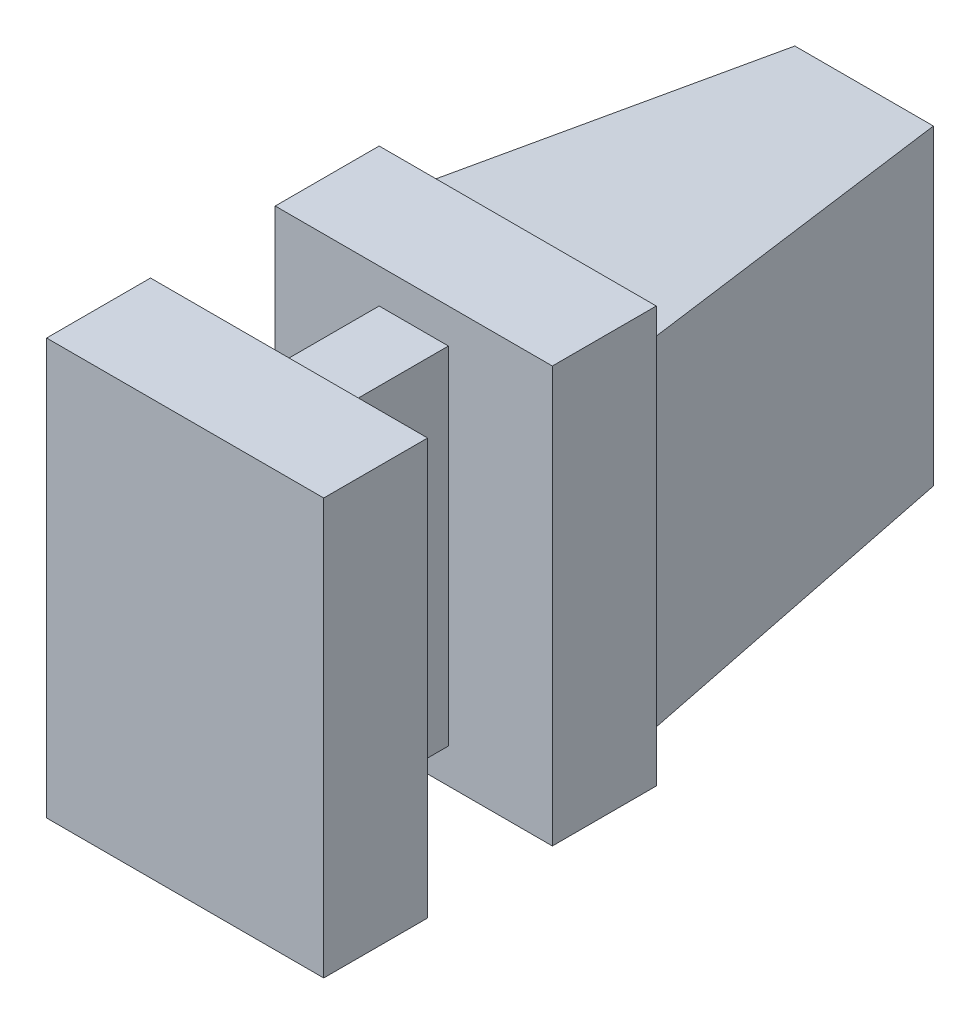
ISO-10303-21;
HEADER;
FILE_DESCRIPTION(('STEP AP214'),'2;1');
FILE_NAME('part.step','',(''),(''),'','','');
FILE_SCHEMA(('AUTOMOTIVE_DESIGN { 1 0 10303 214 1 1 1 1 }'));
ENDSEC;
DATA;
#1=APPLICATION_CONTEXT('core data for automotive mechanical design processes');
#2=APPLICATION_PROTOCOL_DEFINITION('international standard','automotive_design',2000,#1);
#3=PRODUCT_CONTEXT('',#1,'mechanical');
#4=PRODUCT('Part','Part','',(#3));
#5=PRODUCT_RELATED_PRODUCT_CATEGORY('part','',(#4));
#6=PRODUCT_DEFINITION_FORMATION('','',#4);
#7=PRODUCT_DEFINITION_CONTEXT('part definition',#1,'design');
#8=PRODUCT_DEFINITION('design','',#6,#7);
#9=PRODUCT_DEFINITION_SHAPE('','',#8);
#10=(LENGTH_UNIT() NAMED_UNIT(*) SI_UNIT(.MILLI.,.METRE.));
#11=(NAMED_UNIT(*) PLANE_ANGLE_UNIT() SI_UNIT($,.RADIAN.));
#12=(NAMED_UNIT(*) SI_UNIT($,.STERADIAN.) SOLID_ANGLE_UNIT());
#13=UNCERTAINTY_MEASURE_WITH_UNIT(LENGTH_MEASURE(1.E-05),#10,'distance_accuracy_value','');
#14=(GEOMETRIC_REPRESENTATION_CONTEXT(3) GLOBAL_UNCERTAINTY_ASSIGNED_CONTEXT((#13)) GLOBAL_UNIT_ASSIGNED_CONTEXT((#10,
#11,#12)) REPRESENTATION_CONTEXT('',''));
#15=CARTESIAN_POINT('',(0.,0.,0.));
#16=DIRECTION('',(0.,0.,1.));
#17=DIRECTION('',(1.,0.,0.));
#18=AXIS2_PLACEMENT_3D('',#15,#16,#17);
#19=CARTESIAN_POINT('',(0.500000000000001,2.5,1.8));
#20=DIRECTION('',(-1.,0.,0.));
#21=DIRECTION('',(0.,-1.,0.));
#22=AXIS2_PLACEMENT_3D('',#19,#20,#21);
#23=PLANE('',#22);
#24=DIRECTION('',(0.,1.,0.));
#25=VECTOR('',#24,1.);
#26=CARTESIAN_POINT('',(0.500000000000001,2.5,0.));
#27=LINE('',#26,#25);
#28=CARTESIAN_POINT('',(0.500000000000002,-2.5,0.));
#29=VERTEX_POINT('',#28);
#30=CARTESIAN_POINT('',(0.500000000000002,2.5,0.));
#31=VERTEX_POINT('',#30);
#32=EDGE_CURVE('E78',#29,#31,#27,.T.);
#33=ORIENTED_EDGE('',*,*,#32,.T.);
#34=DIRECTION('',(0.,0.,-1.));
#35=VECTOR('',#34,1.);
#36=CARTESIAN_POINT('',(0.500000000000001,2.5,1.8));
#37=LINE('',#36,#35);
#38=CARTESIAN_POINT('',(0.500000000000001,2.5,1.8));
#39=VERTEX_POINT('',#38);
#40=EDGE_CURVE('E12',#39,#31,#37,.T.);
#41=ORIENTED_EDGE('',*,*,#40,.F.);
#42=DIRECTION('',(0.,1.,0.));
#43=VECTOR('',#42,1.);
#44=CARTESIAN_POINT('',(0.500000000000001,2.5,1.8));
#45=LINE('',#44,#43);
#46=CARTESIAN_POINT('',(0.500000000000002,-2.5,1.8));
#47=VERTEX_POINT('',#46);
#48=EDGE_CURVE('E337',#47,#39,#45,.T.);
#49=ORIENTED_EDGE('',*,*,#48,.F.);
#50=DIRECTION('',(0.,0.,-1.));
#51=VECTOR('',#50,1.);
#52=CARTESIAN_POINT('',(0.500000000000002,-2.5,1.8));
#53=LINE('',#52,#51);
#54=EDGE_CURVE('E322',#47,#29,#53,.T.);
#55=ORIENTED_EDGE('',*,*,#54,.T.);
#56=EDGE_LOOP('',(#33,#41,#49,#55));
#57=FACE_BOUND('',#56,.T.);
#58=ADVANCED_FACE('F40',(#57),#23,.F.);
#59=CARTESIAN_POINT('',(-0.499999999999999,2.5,1.8));
#60=DIRECTION('',(0.,-1.,0.));
#61=DIRECTION('',(0.,0.,-1.));
#62=AXIS2_PLACEMENT_3D('',#59,#60,#61);
#63=PLANE('',#62);
#64=DIRECTION('',(-1.,0.,0.));
#65=VECTOR('',#64,1.);
#66=CARTESIAN_POINT('',(-0.499999999999999,2.5,0.));
#67=LINE('',#66,#65);
#68=CARTESIAN_POINT('',(-0.499999999999999,2.5,0.));
#69=VERTEX_POINT('',#68);
#70=EDGE_CURVE('E85',#31,#69,#67,.T.);
#71=ORIENTED_EDGE('',*,*,#70,.T.);
#72=DIRECTION('',(0.,0.,-1.));
#73=VECTOR('',#72,1.);
#74=CARTESIAN_POINT('',(-0.499999999999999,2.5,1.8));
#75=LINE('',#74,#73);
#76=CARTESIAN_POINT('',(-0.499999999999999,2.5,1.8));
#77=VERTEX_POINT('',#76);
#78=EDGE_CURVE('E48',#77,#69,#75,.T.);
#79=ORIENTED_EDGE('',*,*,#78,.F.);
#80=DIRECTION('',(-1.,0.,0.));
#81=VECTOR('',#80,1.);
#82=CARTESIAN_POINT('',(-0.499999999999999,2.5,1.8));
#83=LINE('',#82,#81);
#84=EDGE_CURVE('E401',#39,#77,#83,.T.);
#85=ORIENTED_EDGE('',*,*,#84,.F.);
#86=ORIENTED_EDGE('',*,*,#40,.T.);
#87=EDGE_LOOP('',(#71,#79,#85,#86));
#88=FACE_BOUND('',#87,.T.);
#89=ADVANCED_FACE('F311',(#88),#63,.F.);
#90=CARTESIAN_POINT('',(-0.499999999999999,2.5,1.8));
#91=DIRECTION('',(1.,0.,0.));
#92=DIRECTION('',(0.,1.,0.));
#93=AXIS2_PLACEMENT_3D('',#90,#91,#92);
#94=PLANE('',#93);
#95=DIRECTION('',(0.,-1.,0.));
#96=VECTOR('',#95,1.);
#97=CARTESIAN_POINT('',(-0.499999999999999,2.5,0.));
#98=LINE('',#97,#96);
#99=CARTESIAN_POINT('',(-0.499999999999998,-2.5,0.));
#100=VERTEX_POINT('',#99);
#101=EDGE_CURVE('E325',#69,#100,#98,.T.);
#102=ORIENTED_EDGE('',*,*,#101,.T.);
#103=DIRECTION('',(0.,0.,-1.));
#104=VECTOR('',#103,1.);
#105=CARTESIAN_POINT('',(-0.499999999999998,-2.5,1.8));
#106=LINE('',#105,#104);
#107=CARTESIAN_POINT('',(-0.499999999999998,-2.5,1.8));
#108=VERTEX_POINT('',#107);
#109=EDGE_CURVE('E65',#108,#100,#106,.T.);
#110=ORIENTED_EDGE('',*,*,#109,.F.);
#111=DIRECTION('',(0.,-1.,0.));
#112=VECTOR('',#111,1.);
#113=CARTESIAN_POINT('',(-0.499999999999999,2.5,1.8));
#114=LINE('',#113,#112);
#115=EDGE_CURVE('E403',#77,#108,#114,.T.);
#116=ORIENTED_EDGE('',*,*,#115,.F.);
#117=ORIENTED_EDGE('',*,*,#78,.T.);
#118=EDGE_LOOP('',(#102,#110,#116,#117));
#119=FACE_BOUND('',#118,.T.);
#120=ADVANCED_FACE('F316',(#119),#94,.F.);
#121=CARTESIAN_POINT('',(-0.499999999999998,-2.5,1.8));
#122=DIRECTION('',(0.,1.,0.));
#123=DIRECTION('',(0.,0.,1.));
#124=AXIS2_PLACEMENT_3D('',#121,#122,#123);
#125=PLANE('',#124);
#126=DIRECTION('',(1.,0.,0.));
#127=VECTOR('',#126,1.);
#128=CARTESIAN_POINT('',(-0.499999999999998,-2.5,0.));
#129=LINE('',#128,#127);
#130=EDGE_CURVE('E335',#100,#29,#129,.T.);
#131=ORIENTED_EDGE('',*,*,#130,.T.);
#132=ORIENTED_EDGE('',*,*,#54,.F.);
#133=DIRECTION('',(1.,0.,0.));
#134=VECTOR('',#133,1.);
#135=CARTESIAN_POINT('',(-0.499999999999998,-2.5,1.8));
#136=LINE('',#135,#134);
#137=EDGE_CURVE('E331',#108,#47,#136,.T.);
#138=ORIENTED_EDGE('',*,*,#137,.F.);
#139=ORIENTED_EDGE('',*,*,#109,.T.);
#140=EDGE_LOOP('',(#131,#132,#138,#139));
#141=FACE_BOUND('',#140,.T.);
#142=ADVANCED_FACE('F408',(#141),#125,.F.);
#143=CARTESIAN_POINT('',(-2.,3.,0.));
#144=DIRECTION('',(0.,0.,1.));
#145=DIRECTION('',(1.,0.,0.));
#146=AXIS2_PLACEMENT_3D('',#143,#144,#145);
#147=PLANE('',#146);
#148=DIRECTION('',(0.,1.,0.));
#149=VECTOR('',#148,1.);
#150=CARTESIAN_POINT('',(-2.,-3.,0.));
#151=LINE('',#150,#149);
#152=CARTESIAN_POINT('',(-2.,-3.,0.));
#153=VERTEX_POINT('',#152);
#154=CARTESIAN_POINT('',(-2.,3.,0.));
#155=VERTEX_POINT('',#154);
#156=EDGE_CURVE('E376',#153,#155,#151,.T.);
#157=ORIENTED_EDGE('',*,*,#156,.F.);
#158=DIRECTION('',(-1.,0.,0.));
#159=VECTOR('',#158,1.);
#160=CARTESIAN_POINT('',(2.,-3.,0.));
#161=LINE('',#160,#159);
#162=CARTESIAN_POINT('',(2.,-3.,0.));
#163=VERTEX_POINT('',#162);
#164=EDGE_CURVE('E371',#163,#153,#161,.T.);
#165=ORIENTED_EDGE('',*,*,#164,.F.);
#166=DIRECTION('',(0.,-1.,0.));
#167=VECTOR('',#166,1.);
#168=CARTESIAN_POINT('',(2.,-3.,0.));
#169=LINE('',#168,#167);
#170=CARTESIAN_POINT('',(2.,3.,0.));
#171=VERTEX_POINT('',#170);
#172=EDGE_CURVE('E392',#171,#163,#169,.T.);
#173=ORIENTED_EDGE('',*,*,#172,.F.);
#174=DIRECTION('',(1.,0.,0.));
#175=VECTOR('',#174,1.);
#176=CARTESIAN_POINT('',(2.,3.,0.));
#177=LINE('',#176,#175);
#178=EDGE_CURVE('E379',#155,#171,#177,.T.);
#179=ORIENTED_EDGE('',*,*,#178,.F.);
#180=EDGE_LOOP('',(#157,#165,#173,#179));
#181=FACE_BOUND('',#180,.T.);
#182=ORIENTED_EDGE('',*,*,#32,.F.);
#183=ORIENTED_EDGE('',*,*,#130,.F.);
#184=ORIENTED_EDGE('',*,*,#101,.F.);
#185=ORIENTED_EDGE('',*,*,#70,.F.);
#186=EDGE_LOOP('',(#182,#183,#184,#185));
#187=FACE_BOUND('',#186,.T.);
#188=ADVANCED_FACE('F409',(#181,#187),#147,.T.);
#189=CARTESIAN_POINT('',(-2.,-3.,-1.5));
#190=DIRECTION('',(1.,0.,0.));
#191=DIRECTION('',(0.,0.,-1.));
#192=AXIS2_PLACEMENT_3D('',#189,#190,#191);
#193=PLANE('',#192);
#194=ORIENTED_EDGE('',*,*,#156,.T.);
#195=DIRECTION('',(0.,0.,1.));
#196=VECTOR('',#195,1.);
#197=CARTESIAN_POINT('',(-2.,3.,-1.5));
#198=LINE('',#197,#196);
#199=CARTESIAN_POINT('',(-2.,3.,-1.5));
#200=VERTEX_POINT('',#199);
#201=EDGE_CURVE('E323',#200,#155,#198,.T.);
#202=ORIENTED_EDGE('',*,*,#201,.F.);
#203=DIRECTION('',(0.,1.,0.));
#204=VECTOR('',#203,1.);
#205=CARTESIAN_POINT('',(-2.,-3.,-1.5));
#206=LINE('',#205,#204);
#207=CARTESIAN_POINT('',(-2.,-3.,-1.5));
#208=VERTEX_POINT('',#207);
#209=EDGE_CURVE('E362',#208,#200,#206,.T.);
#210=ORIENTED_EDGE('',*,*,#209,.F.);
#211=DIRECTION('',(0.,0.,1.));
#212=VECTOR('',#211,1.);
#213=CARTESIAN_POINT('',(-2.,-3.,-1.5));
#214=LINE('',#213,#212);
#215=EDGE_CURVE('E388',#208,#153,#214,.T.);
#216=ORIENTED_EDGE('',*,*,#215,.T.);
#217=EDGE_LOOP('',(#194,#202,#210,#216));
#218=FACE_BOUND('',#217,.T.);
#219=ADVANCED_FACE('F374',(#218),#193,.F.);
#220=CARTESIAN_POINT('',(2.,3.,-1.5));
#221=DIRECTION('',(0.,-1.,0.));
#222=DIRECTION('',(0.,0.,-1.));
#223=AXIS2_PLACEMENT_3D('',#220,#221,#222);
#224=PLANE('',#223);
#225=ORIENTED_EDGE('',*,*,#178,.T.);
#226=DIRECTION('',(0.,0.,1.));
#227=VECTOR('',#226,1.);
#228=CARTESIAN_POINT('',(2.,3.,-1.5));
#229=LINE('',#228,#227);
#230=CARTESIAN_POINT('',(2.,3.,-1.5));
#231=VERTEX_POINT('',#230);
#232=EDGE_CURVE('E328',#231,#171,#229,.T.);
#233=ORIENTED_EDGE('',*,*,#232,.F.);
#234=DIRECTION('',(1.,0.,0.));
#235=VECTOR('',#234,1.);
#236=CARTESIAN_POINT('',(2.,3.,-1.5));
#237=LINE('',#236,#235);
#238=EDGE_CURVE('E364',#200,#231,#237,.T.);
#239=ORIENTED_EDGE('',*,*,#238,.F.);
#240=ORIENTED_EDGE('',*,*,#201,.T.);
#241=EDGE_LOOP('',(#225,#233,#239,#240));
#242=FACE_BOUND('',#241,.T.);
#243=ADVANCED_FACE('F378',(#242),#224,.F.);
#244=CARTESIAN_POINT('',(2.,-3.,-1.5));
#245=DIRECTION('',(-1.,0.,0.));
#246=DIRECTION('',(0.,0.,1.));
#247=AXIS2_PLACEMENT_3D('',#244,#245,#246);
#248=PLANE('',#247);
#249=ORIENTED_EDGE('',*,*,#172,.T.);
#250=DIRECTION('',(0.,0.,1.));
#251=VECTOR('',#250,1.);
#252=CARTESIAN_POINT('',(2.,-3.,-1.5));
#253=LINE('',#252,#251);
#254=CARTESIAN_POINT('',(2.,-3.,-1.5));
#255=VERTEX_POINT('',#254);
#256=EDGE_CURVE('E396',#255,#163,#253,.T.);
#257=ORIENTED_EDGE('',*,*,#256,.F.);
#258=DIRECTION('',(0.,-1.,0.));
#259=VECTOR('',#258,1.);
#260=CARTESIAN_POINT('',(2.,-3.,-1.5));
#261=LINE('',#260,#259);
#262=EDGE_CURVE('E382',#231,#255,#261,.T.);
#263=ORIENTED_EDGE('',*,*,#262,.F.);
#264=ORIENTED_EDGE('',*,*,#232,.T.);
#265=EDGE_LOOP('',(#249,#257,#263,#264));
#266=FACE_BOUND('',#265,.T.);
#267=ADVANCED_FACE('F421',(#266),#248,.F.);
#268=CARTESIAN_POINT('',(2.,-3.,-1.5));
#269=DIRECTION('',(0.,1.,0.));
#270=DIRECTION('',(0.,0.,1.));
#271=AXIS2_PLACEMENT_3D('',#268,#269,#270);
#272=PLANE('',#271);
#273=ORIENTED_EDGE('',*,*,#164,.T.);
#274=ORIENTED_EDGE('',*,*,#215,.F.);
#275=DIRECTION('',(-1.,0.,0.));
#276=VECTOR('',#275,1.);
#277=CARTESIAN_POINT('',(2.,-3.,-1.5));
#278=LINE('',#277,#276);
#279=EDGE_CURVE('E367',#255,#208,#278,.T.);
#280=ORIENTED_EDGE('',*,*,#279,.F.);
#281=ORIENTED_EDGE('',*,*,#256,.T.);
#282=EDGE_LOOP('',(#273,#274,#280,#281));
#283=FACE_BOUND('',#282,.T.);
#284=ADVANCED_FACE('F358',(#283),#272,.F.);
#285=CARTESIAN_POINT('',(-2.,3.,-1.5));
#286=DIRECTION('',(0.,0.,1.));
#287=DIRECTION('',(1.,0.,0.));
#288=AXIS2_PLACEMENT_3D('',#285,#286,#287);
#289=PLANE('',#288);
#290=DIRECTION('',(1.,0.,0.));
#291=VECTOR('',#290,1.);
#292=CARTESIAN_POINT('',(1.85,2.45,-1.5));
#293=LINE('',#292,#291);
#294=CARTESIAN_POINT('',(-1.85,2.45,-1.5));
#295=VERTEX_POINT('',#294);
#296=CARTESIAN_POINT('',(1.85,2.45,-1.5));
#297=VERTEX_POINT('',#296);
#298=EDGE_CURVE('E195',#295,#297,#293,.T.);
#299=ORIENTED_EDGE('',*,*,#298,.F.);
#300=DIRECTION('',(0.,1.,0.));
#301=VECTOR('',#300,1.);
#302=CARTESIAN_POINT('',(-1.85,2.45,-1.5));
#303=LINE('',#302,#301);
#304=CARTESIAN_POINT('',(-1.85,-2.45,-1.5));
#305=VERTEX_POINT('',#304);
#306=EDGE_CURVE('E349',#305,#295,#303,.T.);
#307=ORIENTED_EDGE('',*,*,#306,.F.);
#308=DIRECTION('',(-1.,0.,0.));
#309=VECTOR('',#308,1.);
#310=CARTESIAN_POINT('',(1.85,-2.45,-1.5));
#311=LINE('',#310,#309);
#312=CARTESIAN_POINT('',(1.85,-2.45,-1.5));
#313=VERTEX_POINT('',#312);
#314=EDGE_CURVE('E345',#313,#305,#311,.T.);
#315=ORIENTED_EDGE('',*,*,#314,.F.);
#316=DIRECTION('',(0.,-1.,0.));
#317=VECTOR('',#316,1.);
#318=CARTESIAN_POINT('',(1.85,2.45,-1.5));
#319=LINE('',#318,#317);
#320=EDGE_CURVE('E194',#297,#313,#319,.T.);
#321=ORIENTED_EDGE('',*,*,#320,.F.);
#322=EDGE_LOOP('',(#299,#307,#315,#321));
#323=FACE_BOUND('',#322,.T.);
#324=ORIENTED_EDGE('',*,*,#209,.T.);
#325=ORIENTED_EDGE('',*,*,#238,.T.);
#326=ORIENTED_EDGE('',*,*,#262,.T.);
#327=ORIENTED_EDGE('',*,*,#279,.T.);
#328=EDGE_LOOP('',(#324,#325,#326,#327));
#329=FACE_BOUND('',#328,.T.);
#330=ADVANCED_FACE('F354',(#323,#329),#289,.F.);
#331=CARTESIAN_POINT('',(-2.,3.,1.8));
#332=DIRECTION('',(0.,0.,-1.));
#333=DIRECTION('',(1.,0.,0.));
#334=AXIS2_PLACEMENT_3D('',#331,#332,#333);
#335=PLANE('',#334);
#336=DIRECTION('',(0.,1.,0.));
#337=VECTOR('',#336,1.);
#338=CARTESIAN_POINT('',(-2.,-3.,1.8));
#339=LINE('',#338,#337);
#340=CARTESIAN_POINT('',(-2.,-3.,1.8));
#341=VERTEX_POINT('',#340);
#342=CARTESIAN_POINT('',(-2.,3.,1.8));
#343=VERTEX_POINT('',#342);
#344=EDGE_CURVE('E255',#341,#343,#339,.T.);
#345=ORIENTED_EDGE('',*,*,#344,.T.);
#346=DIRECTION('',(1.,0.,0.));
#347=VECTOR('',#346,1.);
#348=CARTESIAN_POINT('',(2.,3.,1.8));
#349=LINE('',#348,#347);
#350=CARTESIAN_POINT('',(2.,3.,1.8));
#351=VERTEX_POINT('',#350);
#352=EDGE_CURVE('E456',#343,#351,#349,.T.);
#353=ORIENTED_EDGE('',*,*,#352,.T.);
#354=DIRECTION('',(0.,-1.,0.));
#355=VECTOR('',#354,1.);
#356=CARTESIAN_POINT('',(2.,-3.,1.8));
#357=LINE('',#356,#355);
#358=CARTESIAN_POINT('',(2.,-3.,1.8));
#359=VERTEX_POINT('',#358);
#360=EDGE_CURVE('E465',#351,#359,#357,.T.);
#361=ORIENTED_EDGE('',*,*,#360,.T.);
#362=DIRECTION('',(-1.,0.,0.));
#363=VECTOR('',#362,1.);
#364=CARTESIAN_POINT('',(2.,-3.,1.8));
#365=LINE('',#364,#363);
#366=EDGE_CURVE('E458',#359,#341,#365,.T.);
#367=ORIENTED_EDGE('',*,*,#366,.T.);
#368=EDGE_LOOP('',(#345,#353,#361,#367));
#369=FACE_BOUND('',#368,.T.);
#370=ORIENTED_EDGE('',*,*,#48,.T.);
#371=ORIENTED_EDGE('',*,*,#84,.T.);
#372=ORIENTED_EDGE('',*,*,#115,.T.);
#373=ORIENTED_EDGE('',*,*,#137,.T.);
#374=EDGE_LOOP('',(#370,#371,#372,#373));
#375=FACE_BOUND('',#374,.T.);
#376=ADVANCED_FACE('F357',(#369,#375),#335,.T.);
#377=CARTESIAN_POINT('',(-2.,-3.,3.3));
#378=DIRECTION('',(-1.,0.,0.));
#379=DIRECTION('',(0.,0.,1.));
#380=AXIS2_PLACEMENT_3D('',#377,#378,#379);
#381=PLANE('',#380);
#382=ORIENTED_EDGE('',*,*,#344,.F.);
#383=DIRECTION('',(0.,0.,-1.));
#384=VECTOR('',#383,1.);
#385=CARTESIAN_POINT('',(-2.,-3.,3.3));
#386=LINE('',#385,#384);
#387=CARTESIAN_POINT('',(-2.,-3.,3.3));
#388=VERTEX_POINT('',#387);
#389=EDGE_CURVE('E390',#388,#341,#386,.T.);
#390=ORIENTED_EDGE('',*,*,#389,.F.);
#391=DIRECTION('',(0.,1.,0.));
#392=VECTOR('',#391,1.);
#393=CARTESIAN_POINT('',(-2.,-3.,3.3));
#394=LINE('',#393,#392);
#395=CARTESIAN_POINT('',(-2.,3.,3.3));
#396=VERTEX_POINT('',#395);
#397=EDGE_CURVE('E263',#388,#396,#394,.T.);
#398=ORIENTED_EDGE('',*,*,#397,.T.);
#399=DIRECTION('',(0.,0.,-1.));
#400=VECTOR('',#399,1.);
#401=CARTESIAN_POINT('',(-2.,3.,3.3));
#402=LINE('',#401,#400);
#403=EDGE_CURVE('E461',#396,#343,#402,.T.);
#404=ORIENTED_EDGE('',*,*,#403,.T.);
#405=EDGE_LOOP('',(#382,#390,#398,#404));
#406=FACE_BOUND('',#405,.T.);
#407=ADVANCED_FACE('F431',(#406),#381,.T.);
#408=CARTESIAN_POINT('',(2.,-3.,3.3));
#409=DIRECTION('',(0.,-1.,0.));
#410=DIRECTION('',(0.,0.,-1.));
#411=AXIS2_PLACEMENT_3D('',#408,#409,#410);
#412=PLANE('',#411);
#413=ORIENTED_EDGE('',*,*,#366,.F.);
#414=DIRECTION('',(0.,0.,-1.));
#415=VECTOR('',#414,1.);
#416=CARTESIAN_POINT('',(2.,-3.,3.3));
#417=LINE('',#416,#415);
#418=CARTESIAN_POINT('',(2.,-3.,3.3));
#419=VERTEX_POINT('',#418);
#420=EDGE_CURVE('E474',#419,#359,#417,.T.);
#421=ORIENTED_EDGE('',*,*,#420,.F.);
#422=DIRECTION('',(-1.,0.,0.));
#423=VECTOR('',#422,1.);
#424=CARTESIAN_POINT('',(2.,-3.,3.3));
#425=LINE('',#424,#423);
#426=EDGE_CURVE('E467',#419,#388,#425,.T.);
#427=ORIENTED_EDGE('',*,*,#426,.T.);
#428=ORIENTED_EDGE('',*,*,#389,.T.);
#429=EDGE_LOOP('',(#413,#421,#427,#428));
#430=FACE_BOUND('',#429,.T.);
#431=ADVANCED_FACE('F434',(#430),#412,.T.);
#432=CARTESIAN_POINT('',(2.,-3.,3.3));
#433=DIRECTION('',(1.,0.,0.));
#434=DIRECTION('',(0.,0.,-1.));
#435=AXIS2_PLACEMENT_3D('',#432,#433,#434);
#436=PLANE('',#435);
#437=ORIENTED_EDGE('',*,*,#360,.F.);
#438=DIRECTION('',(0.,0.,-1.));
#439=VECTOR('',#438,1.);
#440=CARTESIAN_POINT('',(2.,3.,3.3));
#441=LINE('',#440,#439);
#442=CARTESIAN_POINT('',(2.,3.,3.3));
#443=VERTEX_POINT('',#442);
#444=EDGE_CURVE('E463',#443,#351,#441,.T.);
#445=ORIENTED_EDGE('',*,*,#444,.F.);
#446=DIRECTION('',(0.,-1.,0.));
#447=VECTOR('',#446,1.);
#448=CARTESIAN_POINT('',(2.,-3.,3.3));
#449=LINE('',#448,#447);
#450=EDGE_CURVE('E481',#443,#419,#449,.T.);
#451=ORIENTED_EDGE('',*,*,#450,.T.);
#452=ORIENTED_EDGE('',*,*,#420,.T.);
#453=EDGE_LOOP('',(#437,#445,#451,#452));
#454=FACE_BOUND('',#453,.T.);
#455=ADVANCED_FACE('F438',(#454),#436,.T.);
#456=CARTESIAN_POINT('',(2.,3.,3.3));
#457=DIRECTION('',(0.,1.,0.));
#458=DIRECTION('',(0.,0.,1.));
#459=AXIS2_PLACEMENT_3D('',#456,#457,#458);
#460=PLANE('',#459);
#461=ORIENTED_EDGE('',*,*,#352,.F.);
#462=ORIENTED_EDGE('',*,*,#403,.F.);
#463=DIRECTION('',(1.,0.,0.));
#464=VECTOR('',#463,1.);
#465=CARTESIAN_POINT('',(2.,3.,3.3));
#466=LINE('',#465,#464);
#467=EDGE_CURVE('E472',#396,#443,#466,.T.);
#468=ORIENTED_EDGE('',*,*,#467,.T.);
#469=ORIENTED_EDGE('',*,*,#444,.T.);
#470=EDGE_LOOP('',(#461,#462,#468,#469));
#471=FACE_BOUND('',#470,.T.);
#472=ADVANCED_FACE('F307',(#471),#460,.T.);
#473=CARTESIAN_POINT('',(-2.,3.,3.3));
#474=DIRECTION('',(0.,0.,-1.));
#475=DIRECTION('',(1.,0.,0.));
#476=AXIS2_PLACEMENT_3D('',#473,#474,#475);
#477=PLANE('',#476);
#478=ORIENTED_EDGE('',*,*,#397,.F.);
#479=ORIENTED_EDGE('',*,*,#426,.F.);
#480=ORIENTED_EDGE('',*,*,#450,.F.);
#481=ORIENTED_EDGE('',*,*,#467,.F.);
#482=EDGE_LOOP('',(#478,#479,#480,#481));
#483=FACE_BOUND('',#482,.T.);
#484=ADVANCED_FACE('F272',(#483),#477,.F.);
#485=CARTESIAN_POINT('',(-1.,-2.25,-6.5));
#486=DIRECTION('',(0.,0.,-1.));
#487=DIRECTION('',(-1.,0.,0.));
#488=AXIS2_PLACEMENT_3D('',#485,#486,#487);
#489=PLANE('',#488);
#490=DIRECTION('',(0.,1.,0.));
#491=VECTOR('',#490,1.);
#492=CARTESIAN_POINT('',(-1.,2.25,-6.5));
#493=LINE('',#492,#491);
#494=CARTESIAN_POINT('',(-1.,-2.25,-6.5));
#495=VERTEX_POINT('',#494);
#496=CARTESIAN_POINT('',(-1.,2.25,-6.5));
#497=VERTEX_POINT('',#496);
#498=EDGE_CURVE('E188',#495,#497,#493,.T.);
#499=ORIENTED_EDGE('',*,*,#498,.T.);
#500=DIRECTION('',(1.,0.,0.));
#501=VECTOR('',#500,1.);
#502=CARTESIAN_POINT('',(1.,2.25,-6.5));
#503=LINE('',#502,#501);
#504=CARTESIAN_POINT('',(1.,2.25,-6.5));
#505=VERTEX_POINT('',#504);
#506=EDGE_CURVE('E170',#497,#505,#503,.T.);
#507=ORIENTED_EDGE('',*,*,#506,.T.);
#508=DIRECTION('',(0.,-1.,0.));
#509=VECTOR('',#508,1.);
#510=CARTESIAN_POINT('',(1.,2.25,-6.5));
#511=LINE('',#510,#509);
#512=CARTESIAN_POINT('',(1.,-2.25,-6.5));
#513=VERTEX_POINT('',#512);
#514=EDGE_CURVE('E162',#505,#513,#511,.T.);
#515=ORIENTED_EDGE('',*,*,#514,.T.);
#516=DIRECTION('',(-1.,0.,0.));
#517=VECTOR('',#516,1.);
#518=CARTESIAN_POINT('',(1.,-2.25,-6.5));
#519=LINE('',#518,#517);
#520=EDGE_CURVE('E167',#513,#495,#519,.T.);
#521=ORIENTED_EDGE('',*,*,#520,.T.);
#522=EDGE_LOOP('',(#499,#507,#515,#521));
#523=FACE_BOUND('',#522,.T.);
#524=ADVANCED_FACE('F166',(#523),#489,.T.);
#525=CARTESIAN_POINT('',(-1.85,2.45,-1.5));
#526=DIRECTION('',(0.,0.999200958721789,-0.0399680383488715));
#527=DIRECTION('',(0.,0.0399680383488715,0.999200958721789));
#528=AXIS2_PLACEMENT_3D('',#525,#526,#527);
#529=PLANE('',#528);
#530=DIRECTION('',(-0.16746533529357,0.0394036083043694,0.985090207609236));
#531=VECTOR('',#530,1.);
#532=CARTESIAN_POINT('',(-1.,2.25,-6.5));
#533=LINE('',#532,#531);
#534=EDGE_CURVE('E56',#497,#295,#533,.T.);
#535=ORIENTED_EDGE('',*,*,#534,.T.);
#536=ORIENTED_EDGE('',*,*,#298,.T.);
#537=DIRECTION('',(0.16746533529357,0.0394036083043694,0.985090207609236));
#538=VECTOR('',#537,1.);
#539=CARTESIAN_POINT('',(1.,2.25,-6.5));
#540=LINE('',#539,#538);
#541=EDGE_CURVE('E242',#505,#297,#540,.T.);
#542=ORIENTED_EDGE('',*,*,#541,.F.);
#543=ORIENTED_EDGE('',*,*,#506,.F.);
#544=EDGE_LOOP('',(#535,#536,#542,#543));
#545=FACE_BOUND('',#544,.T.);
#546=ADVANCED_FACE('F221',(#545),#529,.T.);
#547=CARTESIAN_POINT('',(1.85,2.45,-1.5));
#548=DIRECTION('',(0.985855846669817,0.,-0.167595493933869));
#549=DIRECTION('',(-0.167595493933869,0.,-0.985855846669817));
#550=AXIS2_PLACEMENT_3D('',#547,#548,#549);
#551=PLANE('',#550);
#552=ORIENTED_EDGE('',*,*,#541,.T.);
#553=ORIENTED_EDGE('',*,*,#320,.T.);
#554=DIRECTION('',(0.16746533529357,-0.0394036083043697,0.985090207609236));
#555=VECTOR('',#554,1.);
#556=CARTESIAN_POINT('',(1.,-2.25,-6.5));
#557=LINE('',#556,#555);
#558=EDGE_CURVE('E184',#513,#313,#557,.T.);
#559=ORIENTED_EDGE('',*,*,#558,.F.);
#560=ORIENTED_EDGE('',*,*,#514,.F.);
#561=EDGE_LOOP('',(#552,#553,#559,#560));
#562=FACE_BOUND('',#561,.T.);
#563=ADVANCED_FACE('F192',(#562),#551,.T.);
#564=CARTESIAN_POINT('',(-1.85,-2.45,-1.5));
#565=DIRECTION('',(-0.985855846669817,0.,-0.167595493933869));
#566=DIRECTION('',(-0.167595493933869,0.,0.985855846669817));
#567=AXIS2_PLACEMENT_3D('',#564,#565,#566);
#568=PLANE('',#567);
#569=DIRECTION('',(-0.16746533529357,-0.0394036083043697,0.985090207609236));
#570=VECTOR('',#569,1.);
#571=CARTESIAN_POINT('',(-1.,-2.25,-6.5));
#572=LINE('',#571,#570);
#573=EDGE_CURVE('E187',#495,#305,#572,.T.);
#574=ORIENTED_EDGE('',*,*,#573,.T.);
#575=ORIENTED_EDGE('',*,*,#306,.T.);
#576=ORIENTED_EDGE('',*,*,#534,.F.);
#577=ORIENTED_EDGE('',*,*,#498,.F.);
#578=EDGE_LOOP('',(#574,#575,#576,#577));
#579=FACE_BOUND('',#578,.T.);
#580=ADVANCED_FACE('F220',(#579),#568,.T.);
#581=CARTESIAN_POINT('',(1.85,-2.45,-1.5));
#582=DIRECTION('',(0.,-0.999200958721789,-0.0399680383488719));
#583=DIRECTION('',(0.,0.0399680383488719,-0.999200958721789));
#584=AXIS2_PLACEMENT_3D('',#581,#582,#583);
#585=PLANE('',#584);
#586=ORIENTED_EDGE('',*,*,#558,.T.);
#587=ORIENTED_EDGE('',*,*,#314,.T.);
#588=ORIENTED_EDGE('',*,*,#573,.F.);
#589=ORIENTED_EDGE('',*,*,#520,.F.);
#590=EDGE_LOOP('',(#586,#587,#588,#589));
#591=FACE_BOUND('',#590,.T.);
#592=ADVANCED_FACE('F183',(#591),#585,.T.);
#593=CLOSED_SHELL('',(#58,#89,#120,#142,#188,#219,#243,#267,#284,#330,#376,#407,#431,#455,#472,
#484,#524,#546,#563,#580,#592));
#594=MANIFOLD_SOLID_BREP('B2',#593);
#595=ADVANCED_BREP_SHAPE_REPRESENTATION('',(#18,#594),#14);
#596=SHAPE_DEFINITION_REPRESENTATION(#9,#595);
ENDSEC;
END-ISO-10303-21;
